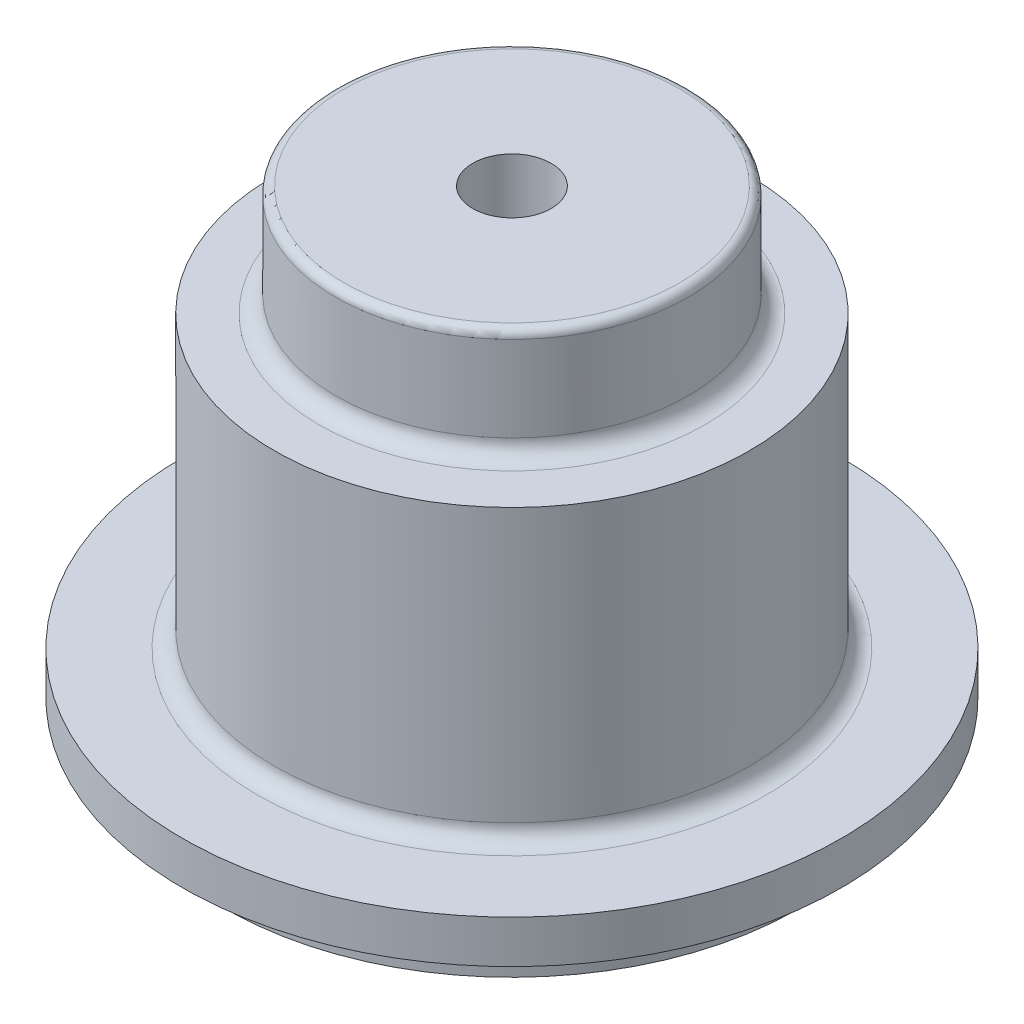
ISO-10303-21;
HEADER;
FILE_DESCRIPTION(('STEP AP214'),'2;1');
FILE_NAME('part.step','',(''),(''),'','','');
FILE_SCHEMA(('AUTOMOTIVE_DESIGN { 1 0 10303 214 1 1 1 1 }'));
ENDSEC;
DATA;
#1=APPLICATION_CONTEXT('core data for automotive mechanical design processes');
#2=APPLICATION_PROTOCOL_DEFINITION('international standard','automotive_design',2000,#1);
#3=PRODUCT_CONTEXT('',#1,'mechanical');
#4=PRODUCT('Part','Part','',(#3));
#5=PRODUCT_RELATED_PRODUCT_CATEGORY('part','',(#4));
#6=PRODUCT_DEFINITION_FORMATION('','',#4);
#7=PRODUCT_DEFINITION_CONTEXT('part definition',#1,'design');
#8=PRODUCT_DEFINITION('design','',#6,#7);
#9=PRODUCT_DEFINITION_SHAPE('','',#8);
#10=(LENGTH_UNIT() NAMED_UNIT(*) SI_UNIT(.MILLI.,.METRE.));
#11=(NAMED_UNIT(*) PLANE_ANGLE_UNIT() SI_UNIT($,.RADIAN.));
#12=(NAMED_UNIT(*) SI_UNIT($,.STERADIAN.) SOLID_ANGLE_UNIT());
#13=UNCERTAINTY_MEASURE_WITH_UNIT(LENGTH_MEASURE(1.E-05),#10,'distance_accuracy_value','');
#14=(GEOMETRIC_REPRESENTATION_CONTEXT(3) GLOBAL_UNCERTAINTY_ASSIGNED_CONTEXT((#13)) GLOBAL_UNIT_ASSIGNED_CONTEXT((#10,
#11,#12)) REPRESENTATION_CONTEXT('',''));
#15=CARTESIAN_POINT('',(0.,0.,0.));
#16=DIRECTION('',(0.,0.,1.));
#17=DIRECTION('',(1.,0.,0.));
#18=AXIS2_PLACEMENT_3D('',#15,#16,#17);
#19=CARTESIAN_POINT('',(0.,25.3,0.));
#20=DIRECTION('',(0.,1.,0.));
#21=DIRECTION('',(0.,0.,1.));
#22=AXIS2_PLACEMENT_3D('',#19,#20,#21);
#23=PLANE('',#22);
#24=CARTESIAN_POINT('',(0.,25.3,0.));
#25=DIRECTION('',(0.,-1.,0.));
#26=DIRECTION('',(0.,0.,-1.));
#27=AXIS2_PLACEMENT_3D('',#24,#25,#26);
#28=CIRCLE('',#27,12.3346398960364);
#29=CARTESIAN_POINT('',(0.,25.3,-12.3346398960364));
#30=VERTEX_POINT('',#29);
#31=EDGE_CURVE('E62',#30,#30,#28,.T.);
#32=ORIENTED_EDGE('',*,*,#31,.T.);
#33=EDGE_LOOP('',(#32));
#34=FACE_BOUND('',#33,.T.);
#35=ADVANCED_FACE('F36',(#34),#23,.F.);
#36=CARTESIAN_POINT('',(0.,0.,0.));
#37=DIRECTION('',(0.,-1.,0.));
#38=DIRECTION('',(0.,0.,-1.));
#39=AXIS2_PLACEMENT_3D('',#36,#37,#38);
#40=CYLINDRICAL_SURFACE('',#39,12.3346398960364);
#41=ORIENTED_EDGE('',*,*,#31,.F.);
#42=EDGE_LOOP('',(#41));
#43=FACE_BOUND('',#42,.T.);
#44=CARTESIAN_POINT('',(0.,0.,0.));
#45=DIRECTION('',(0.,-1.,0.));
#46=DIRECTION('',(0.,0.,-1.));
#47=AXIS2_PLACEMENT_3D('',#44,#45,#46);
#48=CIRCLE('',#47,12.3346398960364);
#49=CARTESIAN_POINT('',(0.,0.,-12.3346398960364));
#50=VERTEX_POINT('',#49);
#51=EDGE_CURVE('E65',#50,#50,#48,.T.);
#52=ORIENTED_EDGE('',*,*,#51,.T.);
#53=EDGE_LOOP('',(#52));
#54=FACE_BOUND('',#53,.T.);
#55=ADVANCED_FACE('F107',(#43,#54),#40,.F.);
#56=CARTESIAN_POINT('',(0.,0.,0.));
#57=DIRECTION('',(0.,-1.,0.));
#58=DIRECTION('',(0.,0.,-1.));
#59=AXIS2_PLACEMENT_3D('',#56,#57,#58);
#60=PLANE('',#59);
#61=CARTESIAN_POINT('',(0.,0.,0.));
#62=DIRECTION('',(0.,-1.,0.));
#63=DIRECTION('',(0.,0.,-1.));
#64=AXIS2_PLACEMENT_3D('',#61,#62,#63);
#65=CIRCLE('',#64,21.75);
#66=CARTESIAN_POINT('',(0.,0.,-21.75));
#67=VERTEX_POINT('',#66);
#68=EDGE_CURVE('E68',#67,#67,#65,.T.);
#69=ORIENTED_EDGE('',*,*,#68,.T.);
#70=EDGE_LOOP('',(#69));
#71=FACE_BOUND('',#70,.T.);
#72=ORIENTED_EDGE('',*,*,#51,.F.);
#73=EDGE_LOOP('',(#72));
#74=FACE_BOUND('',#73,.T.);
#75=ADVANCED_FACE('F113',(#71,#74),#60,.T.);
#76=CARTESIAN_POINT('',(0.,0.,0.));
#77=DIRECTION('',(0.,-1.,0.));
#78=DIRECTION('',(0.,0.,-1.));
#79=AXIS2_PLACEMENT_3D('',#76,#77,#78);
#80=CYLINDRICAL_SURFACE('',#79,21.75);
#81=CARTESIAN_POINT('',(0.,3.,0.));
#82=DIRECTION('',(0.,-1.,0.));
#83=DIRECTION('',(0.,0.,-1.));
#84=AXIS2_PLACEMENT_3D('',#81,#82,#83);
#85=CIRCLE('',#84,21.75);
#86=CARTESIAN_POINT('',(0.,3.,-21.75));
#87=VERTEX_POINT('',#86);
#88=EDGE_CURVE('E71',#87,#87,#85,.T.);
#89=ORIENTED_EDGE('',*,*,#88,.T.);
#90=EDGE_LOOP('',(#89));
#91=FACE_BOUND('',#90,.T.);
#92=ORIENTED_EDGE('',*,*,#68,.F.);
#93=EDGE_LOOP('',(#92));
#94=FACE_BOUND('',#93,.T.);
#95=ADVANCED_FACE('F153',(#91,#94),#80,.T.);
#96=CARTESIAN_POINT('',(0.,3.,0.));
#97=DIRECTION('',(0.,-1.,0.));
#98=DIRECTION('',(0.,0.,-1.));
#99=AXIS2_PLACEMENT_3D('',#96,#97,#98);
#100=PLANE('',#99);
#101=CARTESIAN_POINT('',(0.,3.,0.));
#102=DIRECTION('',(0.,-1.,0.));
#103=DIRECTION('',(0.,0.,-1.));
#104=AXIS2_PLACEMENT_3D('',#101,#102,#103);
#105=CIRCLE('',#104,25.);
#106=CARTESIAN_POINT('',(0.,3.,-25.));
#107=VERTEX_POINT('',#106);
#108=EDGE_CURVE('E74',#107,#107,#105,.T.);
#109=ORIENTED_EDGE('',*,*,#108,.T.);
#110=EDGE_LOOP('',(#109));
#111=FACE_BOUND('',#110,.T.);
#112=ORIENTED_EDGE('',*,*,#88,.F.);
#113=EDGE_LOOP('',(#112));
#114=FACE_BOUND('',#113,.T.);
#115=ADVANCED_FACE('F149',(#111,#114),#100,.T.);
#116=CARTESIAN_POINT('',(0.,0.,0.));
#117=DIRECTION('',(0.,-1.,0.));
#118=DIRECTION('',(0.,0.,-1.));
#119=AXIS2_PLACEMENT_3D('',#116,#117,#118);
#120=CYLINDRICAL_SURFACE('',#119,25.);
#121=CARTESIAN_POINT('',(0.,6.25,0.));
#122=DIRECTION('',(0.,-1.,0.));
#123=DIRECTION('',(0.,0.,-1.));
#124=AXIS2_PLACEMENT_3D('',#121,#122,#123);
#125=CIRCLE('',#124,25.);
#126=CARTESIAN_POINT('',(0.,6.25,-25.));
#127=VERTEX_POINT('',#126);
#128=EDGE_CURVE('E77',#127,#127,#125,.T.);
#129=ORIENTED_EDGE('',*,*,#128,.T.);
#130=EDGE_LOOP('',(#129));
#131=FACE_BOUND('',#130,.T.);
#132=ORIENTED_EDGE('',*,*,#108,.F.);
#133=EDGE_LOOP('',(#132));
#134=FACE_BOUND('',#133,.T.);
#135=ADVANCED_FACE('F142',(#131,#134),#120,.T.);
#136=CARTESIAN_POINT('',(0.,6.25,0.));
#137=DIRECTION('',(0.,1.,0.));
#138=DIRECTION('',(0.,0.,1.));
#139=AXIS2_PLACEMENT_3D('',#136,#137,#138);
#140=PLANE('',#139);
#141=CARTESIAN_POINT('',(0.,6.25,0.));
#142=DIRECTION('',(0.,1.,0.));
#143=DIRECTION('',(0.,0.,1.));
#144=AXIS2_PLACEMENT_3D('',#141,#142,#143);
#145=CIRCLE('',#144,19.3056104827136);
#146=CARTESIAN_POINT('',(0.,6.25,19.3056104827136));
#147=VERTEX_POINT('',#146);
#148=EDGE_CURVE('E59',#147,#147,#145,.F.);
#149=ORIENTED_EDGE('',*,*,#148,.T.);
#150=EDGE_LOOP('',(#149));
#151=FACE_BOUND('',#150,.T.);
#152=ORIENTED_EDGE('',*,*,#128,.F.);
#153=EDGE_LOOP('',(#152));
#154=FACE_BOUND('',#153,.T.);
#155=ADVANCED_FACE('F136',(#151,#154),#140,.T.);
#156=CARTESIAN_POINT('',(0.,0.,0.));
#157=DIRECTION('',(0.,-1.,0.));
#158=DIRECTION('',(0.,0.,-1.));
#159=AXIS2_PLACEMENT_3D('',#156,#157,#158);
#160=CYLINDRICAL_SURFACE('',#159,18.0356104827136);
#161=CARTESIAN_POINT('',(0.,7.52,0.));
#162=DIRECTION('',(0.,1.,0.));
#163=DIRECTION('',(0.,0.,1.));
#164=AXIS2_PLACEMENT_3D('',#161,#162,#163);
#165=CIRCLE('',#164,18.0356104827136);
#166=CARTESIAN_POINT('',(0.,7.52,18.0356104827136));
#167=VERTEX_POINT('',#166);
#168=EDGE_CURVE('E56',#167,#167,#165,.T.);
#169=ORIENTED_EDGE('',*,*,#168,.T.);
#170=EDGE_LOOP('',(#169));
#171=FACE_BOUND('',#170,.T.);
#172=CARTESIAN_POINT('',(0.,28.2358712803989,0.));
#173=DIRECTION('',(0.,-1.,0.));
#174=DIRECTION('',(0.,0.,-1.));
#175=AXIS2_PLACEMENT_3D('',#172,#173,#174);
#176=CIRCLE('',#175,18.0356104827136);
#177=CARTESIAN_POINT('',(0.,28.2358712803989,-18.0356104827136));
#178=VERTEX_POINT('',#177);
#179=EDGE_CURVE('E80',#178,#178,#176,.T.);
#180=ORIENTED_EDGE('',*,*,#179,.T.);
#181=EDGE_LOOP('',(#180));
#182=FACE_BOUND('',#181,.T.);
#183=ADVANCED_FACE('F131',(#171,#182),#160,.T.);
#184=CARTESIAN_POINT('',(0.,28.2358712803989,0.));
#185=DIRECTION('',(0.,1.,0.));
#186=DIRECTION('',(0.,0.,1.));
#187=AXIS2_PLACEMENT_3D('',#184,#185,#186);
#188=PLANE('',#187);
#189=CARTESIAN_POINT('',(0.,28.2358712803989,0.));
#190=DIRECTION('',(0.,1.,0.));
#191=DIRECTION('',(0.,0.,1.));
#192=AXIS2_PLACEMENT_3D('',#189,#190,#191);
#193=CIRCLE('',#192,14.640385965295);
#194=CARTESIAN_POINT('',(0.,28.2358712803989,14.640385965295));
#195=VERTEX_POINT('',#194);
#196=EDGE_CURVE('E51',#195,#195,#193,.F.);
#197=ORIENTED_EDGE('',*,*,#196,.T.);
#198=EDGE_LOOP('',(#197));
#199=FACE_BOUND('',#198,.T.);
#200=ORIENTED_EDGE('',*,*,#179,.F.);
#201=EDGE_LOOP('',(#200));
#202=FACE_BOUND('',#201,.T.);
#203=ADVANCED_FACE('F127',(#199,#202),#188,.T.);
#204=CARTESIAN_POINT('',(0.,0.,0.));
#205=DIRECTION('',(0.,-1.,0.));
#206=DIRECTION('',(0.,0.,-1.));
#207=AXIS2_PLACEMENT_3D('',#204,#205,#206);
#208=CYLINDRICAL_SURFACE('',#207,13.370385965295);
#209=CARTESIAN_POINT('',(0.,35.9760951977092,0.));
#210=DIRECTION('',(0.,-1.,0.));
#211=DIRECTION('',(0.,0.,-1.));
#212=AXIS2_PLACEMENT_3D('',#209,#210,#211);
#213=CIRCLE('',#212,13.370385965295);
#214=CARTESIAN_POINT('',(0.,35.9760951977092,-13.370385965295));
#215=VERTEX_POINT('',#214);
#216=EDGE_CURVE('E43',#215,#215,#213,.T.);
#217=ORIENTED_EDGE('',*,*,#216,.T.);
#218=EDGE_LOOP('',(#217));
#219=FACE_BOUND('',#218,.T.);
#220=CARTESIAN_POINT('',(0.,29.5058712803989,0.));
#221=DIRECTION('',(0.,1.,0.));
#222=DIRECTION('',(0.,0.,1.));
#223=AXIS2_PLACEMENT_3D('',#220,#221,#222);
#224=CIRCLE('',#223,13.370385965295);
#225=CARTESIAN_POINT('',(0.,29.5058712803989,13.370385965295));
#226=VERTEX_POINT('',#225);
#227=EDGE_CURVE('E47',#226,#226,#224,.T.);
#228=ORIENTED_EDGE('',*,*,#227,.T.);
#229=EDGE_LOOP('',(#228));
#230=FACE_BOUND('',#229,.T.);
#231=ADVANCED_FACE('F130',(#219,#230),#208,.T.);
#232=CARTESIAN_POINT('',(0.,36.6110951977091,0.));
#233=DIRECTION('',(0.,-1.,0.));
#234=DIRECTION('',(0.,0.,-1.));
#235=AXIS2_PLACEMENT_3D('',#232,#233,#234);
#236=PLANE('',#235);
#237=CARTESIAN_POINT('',(0.,36.6110951977091,0.));
#238=DIRECTION('',(0.,-1.,0.));
#239=DIRECTION('',(0.,0.,-1.));
#240=AXIS2_PLACEMENT_3D('',#237,#238,#239);
#241=CIRCLE('',#240,12.735385965295);
#242=CARTESIAN_POINT('',(0.,36.6110951977091,-12.735385965295));
#243=VERTEX_POINT('',#242);
#244=EDGE_CURVE('E10',#243,#243,#241,.F.);
#245=ORIENTED_EDGE('',*,*,#244,.T.);
#246=EDGE_LOOP('',(#245));
#247=FACE_BOUND('',#246,.T.);
#248=CARTESIAN_POINT('',(0.,36.6110951977091,0.));
#249=DIRECTION('',(0.,-1.,0.));
#250=DIRECTION('',(0.,0.,-1.));
#251=AXIS2_PLACEMENT_3D('',#248,#249,#250);
#252=CIRCLE('',#251,2.97474193372406);
#253=CARTESIAN_POINT('',(0.,36.6110951977091,-2.97474193372406));
#254=VERTEX_POINT('',#253);
#255=EDGE_CURVE('E83',#254,#254,#252,.T.);
#256=ORIENTED_EDGE('',*,*,#255,.T.);
#257=EDGE_LOOP('',(#256));
#258=FACE_BOUND('',#257,.T.);
#259=ADVANCED_FACE('F103',(#247,#258),#236,.F.);
#260=CARTESIAN_POINT('',(0.,0.,0.));
#261=DIRECTION('',(0.,-1.,0.));
#262=DIRECTION('',(0.,0.,-1.));
#263=AXIS2_PLACEMENT_3D('',#260,#261,#262);
#264=CYLINDRICAL_SURFACE('',#263,2.97474193372406);
#265=ORIENTED_EDGE('',*,*,#255,.F.);
#266=EDGE_LOOP('',(#265));
#267=FACE_BOUND('',#266,.T.);
#268=CARTESIAN_POINT('',(0.,28.2358712803989,0.));
#269=DIRECTION('',(0.,-1.,0.));
#270=DIRECTION('',(0.,0.,-1.));
#271=AXIS2_PLACEMENT_3D('',#268,#269,#270);
#272=CIRCLE('',#271,2.97474193372406);
#273=CARTESIAN_POINT('',(0.,28.2358712803989,-2.97474193372406));
#274=VERTEX_POINT('',#273);
#275=EDGE_CURVE('E86',#274,#274,#272,.T.);
#276=ORIENTED_EDGE('',*,*,#275,.T.);
#277=EDGE_LOOP('',(#276));
#278=FACE_BOUND('',#277,.T.);
#279=ADVANCED_FACE('F90',(#267,#278),#264,.F.);
#280=CARTESIAN_POINT('',(0.,28.2358712803989,0.));
#281=DIRECTION('',(0.,1.,0.));
#282=DIRECTION('',(0.,0.,1.));
#283=AXIS2_PLACEMENT_3D('',#280,#281,#282);
#284=PLANE('',#283);
#285=ORIENTED_EDGE('',*,*,#275,.F.);
#286=EDGE_LOOP('',(#285));
#287=FACE_BOUND('',#286,.T.);
#288=ADVANCED_FACE('F92',(#287),#284,.T.);
#289=CARTESIAN_POINT('',(0.,7.52,0.));
#290=DIRECTION('',(0.,1.,0.));
#291=DIRECTION('',(0.,0.,1.));
#292=AXIS2_PLACEMENT_3D('',#289,#290,#291);
#293=TOROIDAL_SURFACE('',#292,19.3056104827136,1.27);
#294=ORIENTED_EDGE('',*,*,#168,.F.);
#295=EDGE_LOOP('',(#294));
#296=FACE_BOUND('',#295,.T.);
#297=ORIENTED_EDGE('',*,*,#148,.F.);
#298=EDGE_LOOP('',(#297));
#299=FACE_BOUND('',#298,.T.);
#300=ADVANCED_FACE('F94',(#296,#299),#293,.F.);
#301=CARTESIAN_POINT('',(0.,29.5058712803989,0.));
#302=DIRECTION('',(0.,1.,0.));
#303=DIRECTION('',(0.,0.,1.));
#304=AXIS2_PLACEMENT_3D('',#301,#302,#303);
#305=TOROIDAL_SURFACE('',#304,14.640385965295,1.27);
#306=ORIENTED_EDGE('',*,*,#227,.F.);
#307=EDGE_LOOP('',(#306));
#308=FACE_BOUND('',#307,.T.);
#309=ORIENTED_EDGE('',*,*,#196,.F.);
#310=EDGE_LOOP('',(#309));
#311=FACE_BOUND('',#310,.T.);
#312=ADVANCED_FACE('F100',(#308,#311),#305,.F.);
#313=CARTESIAN_POINT('',(0.,35.9760951977092,0.));
#314=DIRECTION('',(0.,-1.,0.));
#315=DIRECTION('',(0.,0.,-1.));
#316=AXIS2_PLACEMENT_3D('',#313,#314,#315);
#317=TOROIDAL_SURFACE('',#316,12.735385965295,0.635);
#318=ORIENTED_EDGE('',*,*,#244,.F.);
#319=EDGE_LOOP('',(#318));
#320=FACE_BOUND('',#319,.T.);
#321=ORIENTED_EDGE('',*,*,#216,.F.);
#322=EDGE_LOOP('',(#321));
#323=FACE_BOUND('',#322,.T.);
#324=ADVANCED_FACE('F38',(#320,#323),#317,.T.);
#325=CLOSED_SHELL('',(#35,#55,#75,#95,#115,#135,#155,#183,#203,#231,#259,#279,#288,#300,#312,#324));
#326=MANIFOLD_SOLID_BREP('B2',#325);
#327=ADVANCED_BREP_SHAPE_REPRESENTATION('',(#18,#326),#14);
#328=SHAPE_DEFINITION_REPRESENTATION(#9,#327);
ENDSEC;
END-ISO-10303-21;
